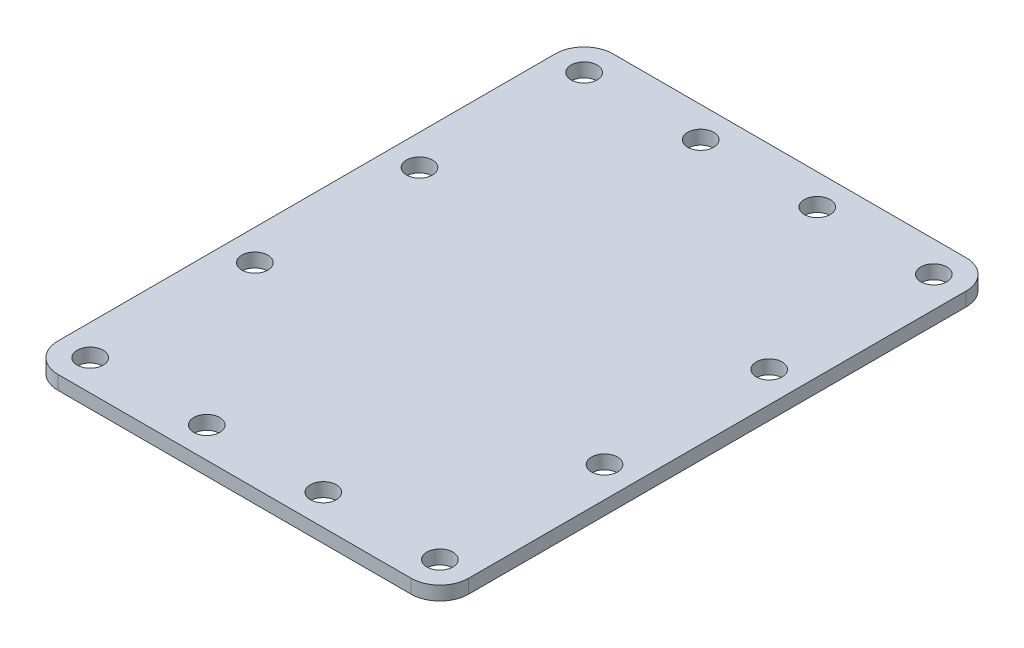
ISO-10303-21;
HEADER;
FILE_DESCRIPTION(('STEP AP214'),'2;1');
FILE_NAME('part.step','',(''),(''),'','','');
FILE_SCHEMA(('AUTOMOTIVE_DESIGN { 1 0 10303 214 1 1 1 1 }'));
ENDSEC;
DATA;
#1=APPLICATION_CONTEXT('core data for automotive mechanical design processes');
#2=APPLICATION_PROTOCOL_DEFINITION('international standard','automotive_design',2000,#1);
#3=PRODUCT_CONTEXT('',#1,'mechanical');
#4=PRODUCT('Part','Part','',(#3));
#5=PRODUCT_RELATED_PRODUCT_CATEGORY('part','',(#4));
#6=PRODUCT_DEFINITION_FORMATION('','',#4);
#7=PRODUCT_DEFINITION_CONTEXT('part definition',#1,'design');
#8=PRODUCT_DEFINITION('design','',#6,#7);
#9=PRODUCT_DEFINITION_SHAPE('','',#8);
#10=(LENGTH_UNIT() NAMED_UNIT(*) SI_UNIT(.MILLI.,.METRE.));
#11=(NAMED_UNIT(*) PLANE_ANGLE_UNIT() SI_UNIT($,.RADIAN.));
#12=(NAMED_UNIT(*) SI_UNIT($,.STERADIAN.) SOLID_ANGLE_UNIT());
#13=UNCERTAINTY_MEASURE_WITH_UNIT(LENGTH_MEASURE(1.E-05),#10,'distance_accuracy_value','');
#14=(GEOMETRIC_REPRESENTATION_CONTEXT(3) GLOBAL_UNCERTAINTY_ASSIGNED_CONTEXT((#13)) GLOBAL_UNIT_ASSIGNED_CONTEXT((#10,
#11,#12)) REPRESENTATION_CONTEXT('',''));
#15=CARTESIAN_POINT('',(0.,0.,0.));
#16=DIRECTION('',(0.,0.,1.));
#17=DIRECTION('',(1.,0.,0.));
#18=AXIS2_PLACEMENT_3D('',#15,#16,#17);
#19=CARTESIAN_POINT('',(-61.2,-4.8,-86.2));
#20=DIRECTION('',(0.,1.,0.));
#21=DIRECTION('',(0.,0.,1.));
#22=AXIS2_PLACEMENT_3D('',#19,#20,#21);
#23=CYLINDRICAL_SURFACE('',#22,10.);
#24=CARTESIAN_POINT('',(-61.2,0.,-86.2));
#25=DIRECTION('',(0.,1.,0.));
#26=DIRECTION('',(0.,0.,1.));
#27=AXIS2_PLACEMENT_3D('',#24,#25,#26);
#28=CIRCLE('',#27,10.);
#29=CARTESIAN_POINT('',(-61.2,0.,-96.2));
#30=VERTEX_POINT('',#29);
#31=CARTESIAN_POINT('',(-71.2,0.,-86.2));
#32=VERTEX_POINT('',#31);
#33=EDGE_CURVE('E140',#30,#32,#28,.T.);
#34=ORIENTED_EDGE('',*,*,#33,.F.);
#35=DIRECTION('',(0.,1.,0.));
#36=VECTOR('',#35,1.);
#37=CARTESIAN_POINT('',(-61.2,-4.8,-96.2));
#38=LINE('',#37,#36);
#39=CARTESIAN_POINT('',(-61.2,-4.8,-96.2));
#40=VERTEX_POINT('',#39);
#41=EDGE_CURVE('E11',#40,#30,#38,.T.);
#42=ORIENTED_EDGE('',*,*,#41,.F.);
#43=CARTESIAN_POINT('',(-61.2,-4.8,-86.2));
#44=DIRECTION('',(0.,1.,0.));
#45=DIRECTION('',(0.,0.,1.));
#46=AXIS2_PLACEMENT_3D('',#43,#44,#45);
#47=CIRCLE('',#46,10.);
#48=CARTESIAN_POINT('',(-71.2,-4.8,-86.2));
#49=VERTEX_POINT('',#48);
#50=EDGE_CURVE('E161',#40,#49,#47,.T.);
#51=ORIENTED_EDGE('',*,*,#50,.T.);
#52=DIRECTION('',(0.,1.,0.));
#53=VECTOR('',#52,1.);
#54=CARTESIAN_POINT('',(-71.2,-4.8,-86.2));
#55=LINE('',#54,#53);
#56=EDGE_CURVE('E46',#49,#32,#55,.T.);
#57=ORIENTED_EDGE('',*,*,#56,.T.);
#58=EDGE_LOOP('',(#34,#42,#51,#57));
#59=FACE_BOUND('',#58,.T.);
#60=ADVANCED_FACE('F43',(#59),#23,.T.);
#61=CARTESIAN_POINT('',(-61.2,-4.8,-96.2));
#62=DIRECTION('',(0.,0.,-1.));
#63=DIRECTION('',(-1.,0.,0.));
#64=AXIS2_PLACEMENT_3D('',#61,#62,#63);
#65=PLANE('',#64);
#66=DIRECTION('',(-1.,0.,0.));
#67=VECTOR('',#66,1.);
#68=CARTESIAN_POINT('',(-61.2,0.,-96.2));
#69=LINE('',#68,#67);
#70=CARTESIAN_POINT('',(61.2,0.,-96.2));
#71=VERTEX_POINT('',#70);
#72=EDGE_CURVE('E159',#71,#30,#69,.T.);
#73=ORIENTED_EDGE('',*,*,#72,.F.);
#74=DIRECTION('',(0.,1.,0.));
#75=VECTOR('',#74,1.);
#76=CARTESIAN_POINT('',(61.2,-4.8,-96.2));
#77=LINE('',#76,#75);
#78=CARTESIAN_POINT('',(61.2,-4.8,-96.2));
#79=VERTEX_POINT('',#78);
#80=EDGE_CURVE('E52',#79,#71,#77,.T.);
#81=ORIENTED_EDGE('',*,*,#80,.F.);
#82=DIRECTION('',(-1.,0.,0.));
#83=VECTOR('',#82,1.);
#84=CARTESIAN_POINT('',(-61.2,-4.8,-96.2));
#85=LINE('',#84,#83);
#86=EDGE_CURVE('E130',#79,#40,#85,.T.);
#87=ORIENTED_EDGE('',*,*,#86,.T.);
#88=ORIENTED_EDGE('',*,*,#41,.T.);
#89=EDGE_LOOP('',(#73,#81,#87,#88));
#90=FACE_BOUND('',#89,.T.);
#91=ADVANCED_FACE('F173',(#90),#65,.T.);
#92=CARTESIAN_POINT('',(61.2,-4.8,-86.2));
#93=DIRECTION('',(0.,1.,0.));
#94=DIRECTION('',(0.,0.,1.));
#95=AXIS2_PLACEMENT_3D('',#92,#93,#94);
#96=CYLINDRICAL_SURFACE('',#95,9.99999999999999);
#97=CARTESIAN_POINT('',(61.2,0.,-86.2));
#98=DIRECTION('',(0.,1.,0.));
#99=DIRECTION('',(0.,0.,1.));
#100=AXIS2_PLACEMENT_3D('',#97,#98,#99);
#101=CIRCLE('',#100,9.99999999999999);
#102=CARTESIAN_POINT('',(71.2,0.,-86.2));
#103=VERTEX_POINT('',#102);
#104=EDGE_CURVE('E117',#103,#71,#101,.T.);
#105=ORIENTED_EDGE('',*,*,#104,.F.);
#106=DIRECTION('',(0.,1.,0.));
#107=VECTOR('',#106,1.);
#108=CARTESIAN_POINT('',(71.2,-4.8,-86.2));
#109=LINE('',#108,#107);
#110=CARTESIAN_POINT('',(71.2,-4.8,-86.2));
#111=VERTEX_POINT('',#110);
#112=EDGE_CURVE('E112',#111,#103,#109,.T.);
#113=ORIENTED_EDGE('',*,*,#112,.F.);
#114=CARTESIAN_POINT('',(61.2,-4.8,-86.2));
#115=DIRECTION('',(0.,1.,0.));
#116=DIRECTION('',(0.,0.,1.));
#117=AXIS2_PLACEMENT_3D('',#114,#115,#116);
#118=CIRCLE('',#117,9.99999999999999);
#119=EDGE_CURVE('E115',#111,#79,#118,.T.);
#120=ORIENTED_EDGE('',*,*,#119,.T.);
#121=ORIENTED_EDGE('',*,*,#80,.T.);
#122=EDGE_LOOP('',(#105,#113,#120,#121));
#123=FACE_BOUND('',#122,.T.);
#124=ADVANCED_FACE('F114',(#123),#96,.T.);
#125=CARTESIAN_POINT('',(71.2,-4.8,86.2));
#126=DIRECTION('',(1.,0.,0.));
#127=DIRECTION('',(0.,0.,-1.));
#128=AXIS2_PLACEMENT_3D('',#125,#126,#127);
#129=PLANE('',#128);
#130=DIRECTION('',(0.,0.,-1.));
#131=VECTOR('',#130,1.);
#132=CARTESIAN_POINT('',(71.2,0.,86.2));
#133=LINE('',#132,#131);
#134=CARTESIAN_POINT('',(71.2,0.,86.2));
#135=VERTEX_POINT('',#134);
#136=EDGE_CURVE('E156',#135,#103,#133,.T.);
#137=ORIENTED_EDGE('',*,*,#136,.F.);
#138=DIRECTION('',(0.,1.,0.));
#139=VECTOR('',#138,1.);
#140=CARTESIAN_POINT('',(71.2,-4.8,86.2));
#141=LINE('',#140,#139);
#142=CARTESIAN_POINT('',(71.2,-4.8,86.2));
#143=VERTEX_POINT('',#142);
#144=EDGE_CURVE('E122',#143,#135,#141,.T.);
#145=ORIENTED_EDGE('',*,*,#144,.F.);
#146=DIRECTION('',(0.,0.,-1.));
#147=VECTOR('',#146,1.);
#148=CARTESIAN_POINT('',(71.2,-4.8,86.2));
#149=LINE('',#148,#147);
#150=EDGE_CURVE('E128',#143,#111,#149,.T.);
#151=ORIENTED_EDGE('',*,*,#150,.T.);
#152=ORIENTED_EDGE('',*,*,#112,.T.);
#153=EDGE_LOOP('',(#137,#145,#151,#152));
#154=FACE_BOUND('',#153,.T.);
#155=ADVANCED_FACE('F132',(#154),#129,.T.);
#156=CARTESIAN_POINT('',(61.2,-4.8,86.2));
#157=DIRECTION('',(0.,1.,0.));
#158=DIRECTION('',(0.,0.,1.));
#159=AXIS2_PLACEMENT_3D('',#156,#157,#158);
#160=CYLINDRICAL_SURFACE('',#159,9.99999999999999);
#161=CARTESIAN_POINT('',(61.2,0.,86.2));
#162=DIRECTION('',(0.,1.,0.));
#163=DIRECTION('',(0.,0.,1.));
#164=AXIS2_PLACEMENT_3D('',#161,#162,#163);
#165=CIRCLE('',#164,9.99999999999999);
#166=CARTESIAN_POINT('',(61.2,0.,96.2));
#167=VERTEX_POINT('',#166);
#168=EDGE_CURVE('E153',#167,#135,#165,.T.);
#169=ORIENTED_EDGE('',*,*,#168,.F.);
#170=DIRECTION('',(0.,1.,0.));
#171=VECTOR('',#170,1.);
#172=CARTESIAN_POINT('',(61.2,-4.8,96.2));
#173=LINE('',#172,#171);
#174=CARTESIAN_POINT('',(61.2,-4.8,96.2));
#175=VERTEX_POINT('',#174);
#176=EDGE_CURVE('E165',#175,#167,#173,.T.);
#177=ORIENTED_EDGE('',*,*,#176,.F.);
#178=CARTESIAN_POINT('',(61.2,-4.8,86.2));
#179=DIRECTION('',(0.,1.,0.));
#180=DIRECTION('',(0.,0.,1.));
#181=AXIS2_PLACEMENT_3D('',#178,#179,#180);
#182=CIRCLE('',#181,9.99999999999999);
#183=EDGE_CURVE('E133',#175,#143,#182,.T.);
#184=ORIENTED_EDGE('',*,*,#183,.T.);
#185=ORIENTED_EDGE('',*,*,#144,.T.);
#186=EDGE_LOOP('',(#169,#177,#184,#185));
#187=FACE_BOUND('',#186,.T.);
#188=ADVANCED_FACE('F186',(#187),#160,.T.);
#189=CARTESIAN_POINT('',(-61.2,-4.8,96.2));
#190=DIRECTION('',(0.,0.,1.));
#191=DIRECTION('',(1.,0.,0.));
#192=AXIS2_PLACEMENT_3D('',#189,#190,#191);
#193=PLANE('',#192);
#194=DIRECTION('',(1.,0.,0.));
#195=VECTOR('',#194,1.);
#196=CARTESIAN_POINT('',(-61.2,0.,96.2));
#197=LINE('',#196,#195);
#198=CARTESIAN_POINT('',(-61.2,0.,96.2));
#199=VERTEX_POINT('',#198);
#200=EDGE_CURVE('E150',#199,#167,#197,.T.);
#201=ORIENTED_EDGE('',*,*,#200,.F.);
#202=DIRECTION('',(0.,1.,0.));
#203=VECTOR('',#202,1.);
#204=CARTESIAN_POINT('',(-61.2,-4.8,96.2));
#205=LINE('',#204,#203);
#206=CARTESIAN_POINT('',(-61.2,-4.8,96.2));
#207=VERTEX_POINT('',#206);
#208=EDGE_CURVE('E167',#207,#199,#205,.T.);
#209=ORIENTED_EDGE('',*,*,#208,.F.);
#210=DIRECTION('',(1.,0.,0.));
#211=VECTOR('',#210,1.);
#212=CARTESIAN_POINT('',(-61.2,-4.8,96.2));
#213=LINE('',#212,#211);
#214=EDGE_CURVE('E135',#207,#175,#213,.T.);
#215=ORIENTED_EDGE('',*,*,#214,.T.);
#216=ORIENTED_EDGE('',*,*,#176,.T.);
#217=EDGE_LOOP('',(#201,#209,#215,#216));
#218=FACE_BOUND('',#217,.T.);
#219=ADVANCED_FACE('F189',(#218),#193,.T.);
#220=CARTESIAN_POINT('',(-61.2,-4.8,86.2));
#221=DIRECTION('',(0.,1.,0.));
#222=DIRECTION('',(0.,0.,1.));
#223=AXIS2_PLACEMENT_3D('',#220,#221,#222);
#224=CYLINDRICAL_SURFACE('',#223,10.);
#225=CARTESIAN_POINT('',(-61.2,0.,86.2));
#226=DIRECTION('',(0.,1.,0.));
#227=DIRECTION('',(0.,0.,1.));
#228=AXIS2_PLACEMENT_3D('',#225,#226,#227);
#229=CIRCLE('',#228,10.);
#230=CARTESIAN_POINT('',(-71.2,0.,86.2));
#231=VERTEX_POINT('',#230);
#232=EDGE_CURVE('E147',#231,#199,#229,.T.);
#233=ORIENTED_EDGE('',*,*,#232,.F.);
#234=DIRECTION('',(0.,1.,0.));
#235=VECTOR('',#234,1.);
#236=CARTESIAN_POINT('',(-71.2,-4.8,86.2));
#237=LINE('',#236,#235);
#238=CARTESIAN_POINT('',(-71.2,-4.8,86.2));
#239=VERTEX_POINT('',#238);
#240=EDGE_CURVE('E168',#239,#231,#237,.T.);
#241=ORIENTED_EDGE('',*,*,#240,.F.);
#242=CARTESIAN_POINT('',(-61.2,-4.8,86.2));
#243=DIRECTION('',(0.,1.,0.));
#244=DIRECTION('',(0.,0.,1.));
#245=AXIS2_PLACEMENT_3D('',#242,#243,#244);
#246=CIRCLE('',#245,10.);
#247=EDGE_CURVE('E335',#239,#207,#246,.T.);
#248=ORIENTED_EDGE('',*,*,#247,.T.);
#249=ORIENTED_EDGE('',*,*,#208,.T.);
#250=EDGE_LOOP('',(#233,#241,#248,#249));
#251=FACE_BOUND('',#250,.T.);
#252=ADVANCED_FACE('F193',(#251),#224,.T.);
#253=CARTESIAN_POINT('',(-71.2,-4.8,86.2));
#254=DIRECTION('',(-1.,0.,0.));
#255=DIRECTION('',(0.,0.,1.));
#256=AXIS2_PLACEMENT_3D('',#253,#254,#255);
#257=PLANE('',#256);
#258=DIRECTION('',(0.,0.,1.));
#259=VECTOR('',#258,1.);
#260=CARTESIAN_POINT('',(-71.2,0.,86.2));
#261=LINE('',#260,#259);
#262=EDGE_CURVE('E143',#32,#231,#261,.T.);
#263=ORIENTED_EDGE('',*,*,#262,.F.);
#264=ORIENTED_EDGE('',*,*,#56,.F.);
#265=DIRECTION('',(0.,0.,1.));
#266=VECTOR('',#265,1.);
#267=CARTESIAN_POINT('',(-71.2,-4.8,86.2));
#268=LINE('',#267,#266);
#269=EDGE_CURVE('E333',#49,#239,#268,.T.);
#270=ORIENTED_EDGE('',*,*,#269,.T.);
#271=ORIENTED_EDGE('',*,*,#240,.T.);
#272=EDGE_LOOP('',(#263,#264,#270,#271));
#273=FACE_BOUND('',#272,.T.);
#274=ADVANCED_FACE('F170',(#273),#257,.T.);
#275=CARTESIAN_POINT('',(-61.2,-4.8,-86.2));
#276=DIRECTION('',(0.,1.,0.));
#277=DIRECTION('',(0.,0.,1.));
#278=AXIS2_PLACEMENT_3D('',#275,#276,#277);
#279=PLANE('',#278);
#280=CARTESIAN_POINT('',(-60.6,-4.8,-28.5333333333333));
#281=DIRECTION('',(0.,1.,0.));
#282=DIRECTION('',(0.,0.,-1.));
#283=AXIS2_PLACEMENT_3D('',#280,#281,#282);
#284=CIRCLE('',#283,4.50000000000002);
#285=CARTESIAN_POINT('',(-60.6,-4.8,-33.0333333333333));
#286=VERTEX_POINT('',#285);
#287=EDGE_CURVE('E260',#286,#286,#284,.T.);
#288=ORIENTED_EDGE('',*,*,#287,.T.);
#289=EDGE_LOOP('',(#288));
#290=FACE_BOUND('',#289,.T.);
#291=CARTESIAN_POINT('',(-60.6,-4.8,28.5333333333333));
#292=DIRECTION('',(0.,1.,0.));
#293=DIRECTION('',(0.,0.,-1.));
#294=AXIS2_PLACEMENT_3D('',#291,#292,#293);
#295=CIRCLE('',#294,4.5);
#296=CARTESIAN_POINT('',(-60.6,-4.8,24.0333333333333));
#297=VERTEX_POINT('',#296);
#298=EDGE_CURVE('E268',#297,#297,#295,.T.);
#299=ORIENTED_EDGE('',*,*,#298,.T.);
#300=EDGE_LOOP('',(#299));
#301=FACE_BOUND('',#300,.T.);
#302=CARTESIAN_POINT('',(-20.2,-4.8,85.6));
#303=DIRECTION('',(0.,1.,0.));
#304=DIRECTION('',(0.,0.,-1.));
#305=AXIS2_PLACEMENT_3D('',#302,#303,#304);
#306=CIRCLE('',#305,4.50000000000001);
#307=CARTESIAN_POINT('',(-20.2,-4.8,81.1));
#308=VERTEX_POINT('',#307);
#309=EDGE_CURVE('E274',#308,#308,#306,.T.);
#310=ORIENTED_EDGE('',*,*,#309,.T.);
#311=EDGE_LOOP('',(#310));
#312=FACE_BOUND('',#311,.T.);
#313=CARTESIAN_POINT('',(20.2,-4.8,85.6));
#314=DIRECTION('',(0.,1.,0.));
#315=DIRECTION('',(0.,0.,-1.));
#316=AXIS2_PLACEMENT_3D('',#313,#314,#315);
#317=CIRCLE('',#316,4.50000000000001);
#318=CARTESIAN_POINT('',(20.2,-4.8,81.1));
#319=VERTEX_POINT('',#318);
#320=EDGE_CURVE('E280',#319,#319,#317,.T.);
#321=ORIENTED_EDGE('',*,*,#320,.T.);
#322=EDGE_LOOP('',(#321));
#323=FACE_BOUND('',#322,.T.);
#324=CARTESIAN_POINT('',(60.6,-4.8,28.5333333333333));
#325=DIRECTION('',(0.,1.,0.));
#326=DIRECTION('',(0.,0.,1.));
#327=AXIS2_PLACEMENT_3D('',#324,#325,#326);
#328=CIRCLE('',#327,4.49999999999999);
#329=CARTESIAN_POINT('',(60.6,-4.8,33.0333333333333));
#330=VERTEX_POINT('',#329);
#331=EDGE_CURVE('E286',#330,#330,#328,.T.);
#332=ORIENTED_EDGE('',*,*,#331,.T.);
#333=EDGE_LOOP('',(#332));
#334=FACE_BOUND('',#333,.T.);
#335=CARTESIAN_POINT('',(60.6,-4.8,-28.5333333333333));
#336=DIRECTION('',(0.,1.,0.));
#337=DIRECTION('',(0.,0.,1.));
#338=AXIS2_PLACEMENT_3D('',#335,#336,#337);
#339=CIRCLE('',#338,4.50000000000002);
#340=CARTESIAN_POINT('',(60.6,-4.8,-24.0333333333333));
#341=VERTEX_POINT('',#340);
#342=EDGE_CURVE('E292',#341,#341,#339,.T.);
#343=ORIENTED_EDGE('',*,*,#342,.T.);
#344=EDGE_LOOP('',(#343));
#345=FACE_BOUND('',#344,.T.);
#346=CARTESIAN_POINT('',(20.2,-4.8,-85.6));
#347=DIRECTION('',(0.,1.,0.));
#348=DIRECTION('',(0.,0.,1.));
#349=AXIS2_PLACEMENT_3D('',#346,#347,#348);
#350=CIRCLE('',#349,4.50000000000001);
#351=CARTESIAN_POINT('',(20.2,-4.8,-81.1));
#352=VERTEX_POINT('',#351);
#353=EDGE_CURVE('E298',#352,#352,#350,.T.);
#354=ORIENTED_EDGE('',*,*,#353,.T.);
#355=EDGE_LOOP('',(#354));
#356=FACE_BOUND('',#355,.T.);
#357=CARTESIAN_POINT('',(-20.2,-4.8,-85.6));
#358=DIRECTION('',(0.,1.,0.));
#359=DIRECTION('',(0.,0.,1.));
#360=AXIS2_PLACEMENT_3D('',#357,#358,#359);
#361=CIRCLE('',#360,4.50000000000001);
#362=CARTESIAN_POINT('',(-20.2,-4.8,-81.1));
#363=VERTEX_POINT('',#362);
#364=EDGE_CURVE('E304',#363,#363,#361,.T.);
#365=ORIENTED_EDGE('',*,*,#364,.T.);
#366=EDGE_LOOP('',(#365));
#367=FACE_BOUND('',#366,.T.);
#368=CARTESIAN_POINT('',(60.6,-4.8,85.6));
#369=DIRECTION('',(0.,1.,0.));
#370=DIRECTION('',(0.,0.,1.));
#371=AXIS2_PLACEMENT_3D('',#368,#369,#370);
#372=CIRCLE('',#371,4.50000000000002);
#373=CARTESIAN_POINT('',(60.6,-4.8,90.1));
#374=VERTEX_POINT('',#373);
#375=EDGE_CURVE('E310',#374,#374,#372,.T.);
#376=ORIENTED_EDGE('',*,*,#375,.T.);
#377=EDGE_LOOP('',(#376));
#378=FACE_BOUND('',#377,.T.);
#379=CARTESIAN_POINT('',(-60.6,-4.8,85.6));
#380=DIRECTION('',(0.,1.,0.));
#381=DIRECTION('',(0.,0.,1.));
#382=AXIS2_PLACEMENT_3D('',#379,#380,#381);
#383=CIRCLE('',#382,4.5);
#384=CARTESIAN_POINT('',(-60.6,-4.8,90.1));
#385=VERTEX_POINT('',#384);
#386=EDGE_CURVE('E316',#385,#385,#383,.T.);
#387=ORIENTED_EDGE('',*,*,#386,.T.);
#388=EDGE_LOOP('',(#387));
#389=FACE_BOUND('',#388,.T.);
#390=CARTESIAN_POINT('',(60.6,-4.8,-85.6));
#391=DIRECTION('',(0.,1.,0.));
#392=DIRECTION('',(0.,0.,1.));
#393=AXIS2_PLACEMENT_3D('',#390,#391,#392);
#394=CIRCLE('',#393,4.50000000000002);
#395=CARTESIAN_POINT('',(60.6,-4.8,-81.1));
#396=VERTEX_POINT('',#395);
#397=EDGE_CURVE('E322',#396,#396,#394,.T.);
#398=ORIENTED_EDGE('',*,*,#397,.T.);
#399=EDGE_LOOP('',(#398));
#400=FACE_BOUND('',#399,.T.);
#401=CARTESIAN_POINT('',(-60.6,-4.8,-85.6));
#402=DIRECTION('',(0.,1.,0.));
#403=DIRECTION('',(0.,0.,1.));
#404=AXIS2_PLACEMENT_3D('',#401,#402,#403);
#405=CIRCLE('',#404,4.5);
#406=CARTESIAN_POINT('',(-60.6,-4.8,-81.1));
#407=VERTEX_POINT('',#406);
#408=EDGE_CURVE('E144',#407,#407,#405,.T.);
#409=ORIENTED_EDGE('',*,*,#408,.T.);
#410=EDGE_LOOP('',(#409));
#411=FACE_BOUND('',#410,.T.);
#412=ORIENTED_EDGE('',*,*,#50,.F.);
#413=ORIENTED_EDGE('',*,*,#86,.F.);
#414=ORIENTED_EDGE('',*,*,#119,.F.);
#415=ORIENTED_EDGE('',*,*,#150,.F.);
#416=ORIENTED_EDGE('',*,*,#183,.F.);
#417=ORIENTED_EDGE('',*,*,#214,.F.);
#418=ORIENTED_EDGE('',*,*,#247,.F.);
#419=ORIENTED_EDGE('',*,*,#269,.F.);
#420=EDGE_LOOP('',(#412,#413,#414,#415,#416,#417,#418,#419));
#421=FACE_BOUND('',#420,.T.);
#422=ADVANCED_FACE('F126',(#290,#301,#312,#323,#334,#345,#356,#367,#378,#389,#400,#411,#421),
#279,.F.);
#423=CARTESIAN_POINT('',(-61.2,0.,-86.2));
#424=DIRECTION('',(0.,1.,0.));
#425=DIRECTION('',(0.,0.,1.));
#426=AXIS2_PLACEMENT_3D('',#423,#424,#425);
#427=PLANE('',#426);
#428=CARTESIAN_POINT('',(-60.6,0.,-28.5333333333333));
#429=DIRECTION('',(0.,1.,0.));
#430=DIRECTION('',(0.,0.,-1.));
#431=AXIS2_PLACEMENT_3D('',#428,#429,#430);
#432=CIRCLE('',#431,4.50000000000002);
#433=CARTESIAN_POINT('',(-60.6,0.,-33.0333333333333));
#434=VERTEX_POINT('',#433);
#435=EDGE_CURVE('E263',#434,#434,#432,.T.);
#436=ORIENTED_EDGE('',*,*,#435,.F.);
#437=EDGE_LOOP('',(#436));
#438=FACE_BOUND('',#437,.T.);
#439=CARTESIAN_POINT('',(-60.6,0.,28.5333333333333));
#440=DIRECTION('',(0.,1.,0.));
#441=DIRECTION('',(0.,0.,-1.));
#442=AXIS2_PLACEMENT_3D('',#439,#440,#441);
#443=CIRCLE('',#442,4.5);
#444=CARTESIAN_POINT('',(-60.6,0.,24.0333333333333));
#445=VERTEX_POINT('',#444);
#446=EDGE_CURVE('E265',#445,#445,#443,.T.);
#447=ORIENTED_EDGE('',*,*,#446,.F.);
#448=EDGE_LOOP('',(#447));
#449=FACE_BOUND('',#448,.T.);
#450=CARTESIAN_POINT('',(-20.2,0.,85.6));
#451=DIRECTION('',(0.,1.,0.));
#452=DIRECTION('',(0.,0.,-1.));
#453=AXIS2_PLACEMENT_3D('',#450,#451,#452);
#454=CIRCLE('',#453,4.50000000000001);
#455=CARTESIAN_POINT('',(-20.2,0.,81.1));
#456=VERTEX_POINT('',#455);
#457=EDGE_CURVE('E271',#456,#456,#454,.T.);
#458=ORIENTED_EDGE('',*,*,#457,.F.);
#459=EDGE_LOOP('',(#458));
#460=FACE_BOUND('',#459,.T.);
#461=CARTESIAN_POINT('',(20.2,0.,85.6));
#462=DIRECTION('',(0.,1.,0.));
#463=DIRECTION('',(0.,0.,-1.));
#464=AXIS2_PLACEMENT_3D('',#461,#462,#463);
#465=CIRCLE('',#464,4.50000000000001);
#466=CARTESIAN_POINT('',(20.2,0.,81.1));
#467=VERTEX_POINT('',#466);
#468=EDGE_CURVE('E277',#467,#467,#465,.T.);
#469=ORIENTED_EDGE('',*,*,#468,.F.);
#470=EDGE_LOOP('',(#469));
#471=FACE_BOUND('',#470,.T.);
#472=CARTESIAN_POINT('',(60.6,0.,28.5333333333333));
#473=DIRECTION('',(0.,1.,0.));
#474=DIRECTION('',(0.,0.,1.));
#475=AXIS2_PLACEMENT_3D('',#472,#473,#474);
#476=CIRCLE('',#475,4.49999999999999);
#477=CARTESIAN_POINT('',(60.6,0.,33.0333333333333));
#478=VERTEX_POINT('',#477);
#479=EDGE_CURVE('E283',#478,#478,#476,.T.);
#480=ORIENTED_EDGE('',*,*,#479,.F.);
#481=EDGE_LOOP('',(#480));
#482=FACE_BOUND('',#481,.T.);
#483=CARTESIAN_POINT('',(60.6,0.,-28.5333333333333));
#484=DIRECTION('',(0.,1.,0.));
#485=DIRECTION('',(0.,0.,1.));
#486=AXIS2_PLACEMENT_3D('',#483,#484,#485);
#487=CIRCLE('',#486,4.50000000000002);
#488=CARTESIAN_POINT('',(60.6,0.,-24.0333333333333));
#489=VERTEX_POINT('',#488);
#490=EDGE_CURVE('E289',#489,#489,#487,.T.);
#491=ORIENTED_EDGE('',*,*,#490,.F.);
#492=EDGE_LOOP('',(#491));
#493=FACE_BOUND('',#492,.T.);
#494=CARTESIAN_POINT('',(20.2,0.,-85.6));
#495=DIRECTION('',(0.,1.,0.));
#496=DIRECTION('',(0.,0.,1.));
#497=AXIS2_PLACEMENT_3D('',#494,#495,#496);
#498=CIRCLE('',#497,4.50000000000001);
#499=CARTESIAN_POINT('',(20.2,0.,-81.1));
#500=VERTEX_POINT('',#499);
#501=EDGE_CURVE('E295',#500,#500,#498,.T.);
#502=ORIENTED_EDGE('',*,*,#501,.F.);
#503=EDGE_LOOP('',(#502));
#504=FACE_BOUND('',#503,.T.);
#505=CARTESIAN_POINT('',(-20.2,0.,-85.6));
#506=DIRECTION('',(0.,1.,0.));
#507=DIRECTION('',(0.,0.,1.));
#508=AXIS2_PLACEMENT_3D('',#505,#506,#507);
#509=CIRCLE('',#508,4.50000000000001);
#510=CARTESIAN_POINT('',(-20.2,0.,-81.1));
#511=VERTEX_POINT('',#510);
#512=EDGE_CURVE('E301',#511,#511,#509,.T.);
#513=ORIENTED_EDGE('',*,*,#512,.F.);
#514=EDGE_LOOP('',(#513));
#515=FACE_BOUND('',#514,.T.);
#516=CARTESIAN_POINT('',(60.6,0.,85.6));
#517=DIRECTION('',(0.,1.,0.));
#518=DIRECTION('',(0.,0.,1.));
#519=AXIS2_PLACEMENT_3D('',#516,#517,#518);
#520=CIRCLE('',#519,4.50000000000002);
#521=CARTESIAN_POINT('',(60.6,0.,90.1));
#522=VERTEX_POINT('',#521);
#523=EDGE_CURVE('E307',#522,#522,#520,.T.);
#524=ORIENTED_EDGE('',*,*,#523,.F.);
#525=EDGE_LOOP('',(#524));
#526=FACE_BOUND('',#525,.T.);
#527=CARTESIAN_POINT('',(-60.6,0.,85.6));
#528=DIRECTION('',(0.,1.,0.));
#529=DIRECTION('',(0.,0.,1.));
#530=AXIS2_PLACEMENT_3D('',#527,#528,#529);
#531=CIRCLE('',#530,4.5);
#532=CARTESIAN_POINT('',(-60.6,0.,90.1));
#533=VERTEX_POINT('',#532);
#534=EDGE_CURVE('E313',#533,#533,#531,.T.);
#535=ORIENTED_EDGE('',*,*,#534,.F.);
#536=EDGE_LOOP('',(#535));
#537=FACE_BOUND('',#536,.T.);
#538=CARTESIAN_POINT('',(60.6,0.,-85.6));
#539=DIRECTION('',(0.,1.,0.));
#540=DIRECTION('',(0.,0.,1.));
#541=AXIS2_PLACEMENT_3D('',#538,#539,#540);
#542=CIRCLE('',#541,4.50000000000002);
#543=CARTESIAN_POINT('',(60.6,0.,-81.1));
#544=VERTEX_POINT('',#543);
#545=EDGE_CURVE('E319',#544,#544,#542,.T.);
#546=ORIENTED_EDGE('',*,*,#545,.F.);
#547=EDGE_LOOP('',(#546));
#548=FACE_BOUND('',#547,.T.);
#549=CARTESIAN_POINT('',(-60.6,0.,-85.6));
#550=DIRECTION('',(0.,1.,0.));
#551=DIRECTION('',(0.,0.,1.));
#552=AXIS2_PLACEMENT_3D('',#549,#550,#551);
#553=CIRCLE('',#552,4.5);
#554=CARTESIAN_POINT('',(-60.6,0.,-81.1));
#555=VERTEX_POINT('',#554);
#556=EDGE_CURVE('E325',#555,#555,#553,.T.);
#557=ORIENTED_EDGE('',*,*,#556,.F.);
#558=EDGE_LOOP('',(#557));
#559=FACE_BOUND('',#558,.T.);
#560=ORIENTED_EDGE('',*,*,#33,.T.);
#561=ORIENTED_EDGE('',*,*,#262,.T.);
#562=ORIENTED_EDGE('',*,*,#232,.T.);
#563=ORIENTED_EDGE('',*,*,#200,.T.);
#564=ORIENTED_EDGE('',*,*,#168,.T.);
#565=ORIENTED_EDGE('',*,*,#136,.T.);
#566=ORIENTED_EDGE('',*,*,#104,.T.);
#567=ORIENTED_EDGE('',*,*,#72,.T.);
#568=EDGE_LOOP('',(#560,#561,#562,#563,#564,#565,#566,#567));
#569=FACE_BOUND('',#568,.T.);
#570=ADVANCED_FACE('F172',(#438,#449,#460,#471,#482,#493,#504,#515,#526,#537,#548,#559,#569),
#427,.T.);
#571=CARTESIAN_POINT('',(-60.6,-4.8,-85.6));
#572=DIRECTION('',(0.,1.,0.));
#573=DIRECTION('',(0.,0.,1.));
#574=AXIS2_PLACEMENT_3D('',#571,#572,#573);
#575=CYLINDRICAL_SURFACE('',#574,4.5);
#576=ORIENTED_EDGE('',*,*,#408,.F.);
#577=EDGE_LOOP('',(#576));
#578=FACE_BOUND('',#577,.T.);
#579=ORIENTED_EDGE('',*,*,#556,.T.);
#580=EDGE_LOOP('',(#579));
#581=FACE_BOUND('',#580,.T.);
#582=ADVANCED_FACE('F205',(#578,#581),#575,.F.);
#583=CARTESIAN_POINT('',(60.6,-4.8,-85.6));
#584=DIRECTION('',(0.,1.,0.));
#585=DIRECTION('',(0.,0.,1.));
#586=AXIS2_PLACEMENT_3D('',#583,#584,#585);
#587=CYLINDRICAL_SURFACE('',#586,4.50000000000002);
#588=ORIENTED_EDGE('',*,*,#397,.F.);
#589=EDGE_LOOP('',(#588));
#590=FACE_BOUND('',#589,.T.);
#591=ORIENTED_EDGE('',*,*,#545,.T.);
#592=EDGE_LOOP('',(#591));
#593=FACE_BOUND('',#592,.T.);
#594=ADVANCED_FACE('F212',(#590,#593),#587,.F.);
#595=CARTESIAN_POINT('',(-60.6,-4.8,85.6));
#596=DIRECTION('',(0.,1.,0.));
#597=DIRECTION('',(0.,0.,1.));
#598=AXIS2_PLACEMENT_3D('',#595,#596,#597);
#599=CYLINDRICAL_SURFACE('',#598,4.5);
#600=ORIENTED_EDGE('',*,*,#386,.F.);
#601=EDGE_LOOP('',(#600));
#602=FACE_BOUND('',#601,.T.);
#603=ORIENTED_EDGE('',*,*,#534,.T.);
#604=EDGE_LOOP('',(#603));
#605=FACE_BOUND('',#604,.T.);
#606=ADVANCED_FACE('F216',(#602,#605),#599,.F.);
#607=CARTESIAN_POINT('',(60.6,-4.8,85.6));
#608=DIRECTION('',(0.,1.,0.));
#609=DIRECTION('',(0.,0.,1.));
#610=AXIS2_PLACEMENT_3D('',#607,#608,#609);
#611=CYLINDRICAL_SURFACE('',#610,4.50000000000002);
#612=ORIENTED_EDGE('',*,*,#375,.F.);
#613=EDGE_LOOP('',(#612));
#614=FACE_BOUND('',#613,.T.);
#615=ORIENTED_EDGE('',*,*,#523,.T.);
#616=EDGE_LOOP('',(#615));
#617=FACE_BOUND('',#616,.T.);
#618=ADVANCED_FACE('F220',(#614,#617),#611,.F.);
#619=CARTESIAN_POINT('',(-20.2,-4.8,-85.6));
#620=DIRECTION('',(0.,1.,0.));
#621=DIRECTION('',(0.,0.,1.));
#622=AXIS2_PLACEMENT_3D('',#619,#620,#621);
#623=CYLINDRICAL_SURFACE('',#622,4.50000000000001);
#624=ORIENTED_EDGE('',*,*,#364,.F.);
#625=EDGE_LOOP('',(#624));
#626=FACE_BOUND('',#625,.T.);
#627=ORIENTED_EDGE('',*,*,#512,.T.);
#628=EDGE_LOOP('',(#627));
#629=FACE_BOUND('',#628,.T.);
#630=ADVANCED_FACE('F224',(#626,#629),#623,.F.);
#631=CARTESIAN_POINT('',(20.2,-4.8,-85.6));
#632=DIRECTION('',(0.,1.,0.));
#633=DIRECTION('',(0.,0.,1.));
#634=AXIS2_PLACEMENT_3D('',#631,#632,#633);
#635=CYLINDRICAL_SURFACE('',#634,4.50000000000001);
#636=ORIENTED_EDGE('',*,*,#353,.F.);
#637=EDGE_LOOP('',(#636));
#638=FACE_BOUND('',#637,.T.);
#639=ORIENTED_EDGE('',*,*,#501,.T.);
#640=EDGE_LOOP('',(#639));
#641=FACE_BOUND('',#640,.T.);
#642=ADVANCED_FACE('F228',(#638,#641),#635,.F.);
#643=CARTESIAN_POINT('',(60.6,-4.8,-28.5333333333333));
#644=DIRECTION('',(0.,1.,0.));
#645=DIRECTION('',(0.,0.,1.));
#646=AXIS2_PLACEMENT_3D('',#643,#644,#645);
#647=CYLINDRICAL_SURFACE('',#646,4.50000000000002);
#648=ORIENTED_EDGE('',*,*,#342,.F.);
#649=EDGE_LOOP('',(#648));
#650=FACE_BOUND('',#649,.T.);
#651=ORIENTED_EDGE('',*,*,#490,.T.);
#652=EDGE_LOOP('',(#651));
#653=FACE_BOUND('',#652,.T.);
#654=ADVANCED_FACE('F232',(#650,#653),#647,.F.);
#655=CARTESIAN_POINT('',(60.6,-4.8,28.5333333333333));
#656=DIRECTION('',(0.,1.,0.));
#657=DIRECTION('',(0.,0.,1.));
#658=AXIS2_PLACEMENT_3D('',#655,#656,#657);
#659=CYLINDRICAL_SURFACE('',#658,4.49999999999999);
#660=ORIENTED_EDGE('',*,*,#331,.F.);
#661=EDGE_LOOP('',(#660));
#662=FACE_BOUND('',#661,.T.);
#663=ORIENTED_EDGE('',*,*,#479,.T.);
#664=EDGE_LOOP('',(#663));
#665=FACE_BOUND('',#664,.T.);
#666=ADVANCED_FACE('F236',(#662,#665),#659,.F.);
#667=CARTESIAN_POINT('',(20.2,-4.8,85.6));
#668=DIRECTION('',(0.,1.,0.));
#669=DIRECTION('',(0.,0.,1.));
#670=AXIS2_PLACEMENT_3D('',#667,#668,#669);
#671=CYLINDRICAL_SURFACE('',#670,4.50000000000001);
#672=ORIENTED_EDGE('',*,*,#320,.F.);
#673=EDGE_LOOP('',(#672));
#674=FACE_BOUND('',#673,.T.);
#675=ORIENTED_EDGE('',*,*,#468,.T.);
#676=EDGE_LOOP('',(#675));
#677=FACE_BOUND('',#676,.T.);
#678=ADVANCED_FACE('F240',(#674,#677),#671,.F.);
#679=CARTESIAN_POINT('',(-20.2,-4.8,85.6));
#680=DIRECTION('',(0.,1.,0.));
#681=DIRECTION('',(0.,0.,1.));
#682=AXIS2_PLACEMENT_3D('',#679,#680,#681);
#683=CYLINDRICAL_SURFACE('',#682,4.50000000000001);
#684=ORIENTED_EDGE('',*,*,#309,.F.);
#685=EDGE_LOOP('',(#684));
#686=FACE_BOUND('',#685,.T.);
#687=ORIENTED_EDGE('',*,*,#457,.T.);
#688=EDGE_LOOP('',(#687));
#689=FACE_BOUND('',#688,.T.);
#690=ADVANCED_FACE('F244',(#686,#689),#683,.F.);
#691=CARTESIAN_POINT('',(-60.6,-4.8,28.5333333333333));
#692=DIRECTION('',(0.,1.,0.));
#693=DIRECTION('',(0.,0.,1.));
#694=AXIS2_PLACEMENT_3D('',#691,#692,#693);
#695=CYLINDRICAL_SURFACE('',#694,4.5);
#696=ORIENTED_EDGE('',*,*,#298,.F.);
#697=EDGE_LOOP('',(#696));
#698=FACE_BOUND('',#697,.T.);
#699=ORIENTED_EDGE('',*,*,#446,.T.);
#700=EDGE_LOOP('',(#699));
#701=FACE_BOUND('',#700,.T.);
#702=ADVANCED_FACE('F248',(#698,#701),#695,.F.);
#703=CARTESIAN_POINT('',(-60.6,-4.8,-28.5333333333333));
#704=DIRECTION('',(0.,1.,0.));
#705=DIRECTION('',(0.,0.,1.));
#706=AXIS2_PLACEMENT_3D('',#703,#704,#705);
#707=CYLINDRICAL_SURFACE('',#706,4.50000000000002);
#708=ORIENTED_EDGE('',*,*,#287,.F.);
#709=EDGE_LOOP('',(#708));
#710=FACE_BOUND('',#709,.T.);
#711=ORIENTED_EDGE('',*,*,#435,.T.);
#712=EDGE_LOOP('',(#711));
#713=FACE_BOUND('',#712,.T.);
#714=ADVANCED_FACE('F252',(#710,#713),#707,.F.);
#715=CLOSED_SHELL('',(#60,#91,#124,#155,#188,#219,#252,#274,#422,#570,#582,#594,#606,#618,#630,
#642,#654,#666,#678,#690,#702,#714));
#716=MANIFOLD_SOLID_BREP('B2',#715);
#717=ADVANCED_BREP_SHAPE_REPRESENTATION('',(#18,#716),#14);
#718=SHAPE_DEFINITION_REPRESENTATION(#9,#717);
ENDSEC;
END-ISO-10303-21;
